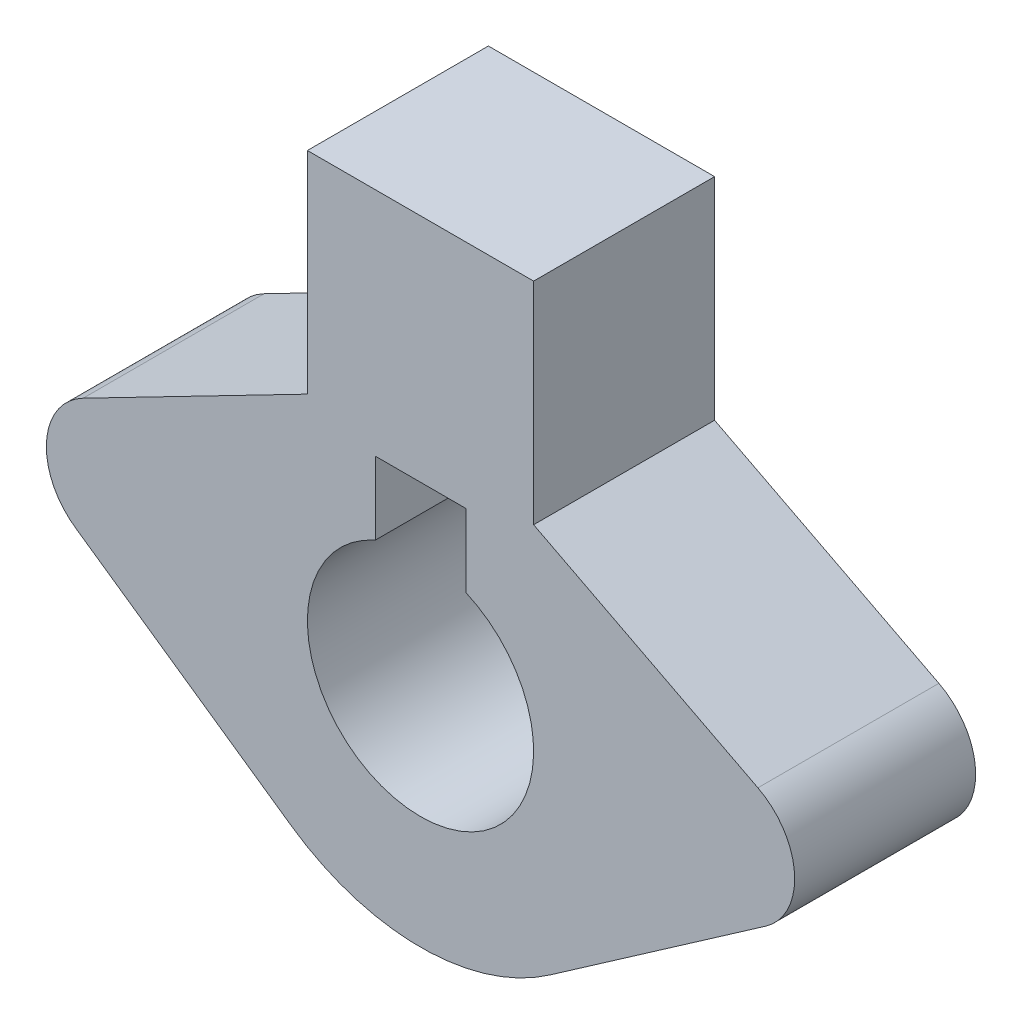
ISO-10303-21;
HEADER;
FILE_DESCRIPTION(('STEP AP214'),'2;1');
FILE_NAME('part.step','',(''),(''),'','','');
FILE_SCHEMA(('AUTOMOTIVE_DESIGN { 1 0 10303 214 1 1 1 1 }'));
ENDSEC;
DATA;
#1=APPLICATION_CONTEXT('core data for automotive mechanical design processes');
#2=APPLICATION_PROTOCOL_DEFINITION('international standard','automotive_design',2000,#1);
#3=PRODUCT_CONTEXT('',#1,'mechanical');
#4=PRODUCT('Part','Part','',(#3));
#5=PRODUCT_RELATED_PRODUCT_CATEGORY('part','',(#4));
#6=PRODUCT_DEFINITION_FORMATION('','',#4);
#7=PRODUCT_DEFINITION_CONTEXT('part definition',#1,'design');
#8=PRODUCT_DEFINITION('design','',#6,#7);
#9=PRODUCT_DEFINITION_SHAPE('','',#8);
#10=(LENGTH_UNIT() NAMED_UNIT(*) SI_UNIT(.MILLI.,.METRE.));
#11=(NAMED_UNIT(*) PLANE_ANGLE_UNIT() SI_UNIT($,.RADIAN.));
#12=(NAMED_UNIT(*) SI_UNIT($,.STERADIAN.) SOLID_ANGLE_UNIT());
#13=UNCERTAINTY_MEASURE_WITH_UNIT(LENGTH_MEASURE(1.E-05),#10,'distance_accuracy_value','');
#14=(GEOMETRIC_REPRESENTATION_CONTEXT(3) GLOBAL_UNCERTAINTY_ASSIGNED_CONTEXT((#13)) GLOBAL_UNIT_ASSIGNED_CONTEXT((#10,
#11,#12)) REPRESENTATION_CONTEXT('',''));
#15=CARTESIAN_POINT('',(0.,0.,0.));
#16=DIRECTION('',(0.,0.,1.));
#17=DIRECTION('',(1.,0.,0.));
#18=AXIS2_PLACEMENT_3D('',#15,#16,#17);
#19=CARTESIAN_POINT('',(0.,0.,8.));
#20=DIRECTION('',(0.,0.,-1.));
#21=DIRECTION('',(-1.,0.,0.));
#22=AXIS2_PLACEMENT_3D('',#19,#20,#21);
#23=CYLINDRICAL_SURFACE('',#22,10.);
#24=CARTESIAN_POINT('',(0.,0.,8.));
#25=DIRECTION('',(0.,0.,1.));
#26=DIRECTION('',(1.,0.,0.));
#27=AXIS2_PLACEMENT_3D('',#24,#25,#26);
#28=CIRCLE('',#27,10.);
#29=CARTESIAN_POINT('',(-5.71153754286938,-8.20843096434352,8.));
#30=VERTEX_POINT('',#29);
#31=CARTESIAN_POINT('',(5.71153754286938,-8.20843096434352,8.));
#32=VERTEX_POINT('',#31);
#33=EDGE_CURVE('E194',#30,#32,#28,.T.);
#34=ORIENTED_EDGE('',*,*,#33,.F.);
#35=DIRECTION('',(0.,0.,-1.));
#36=VECTOR('',#35,1.);
#37=CARTESIAN_POINT('',(-5.71153754286938,-8.20843096434352,30.5851332066531));
#38=LINE('',#37,#36);
#39=CARTESIAN_POINT('',(-5.71153754286938,-8.20843096434352,0.));
#40=VERTEX_POINT('',#39);
#41=EDGE_CURVE('E174',#30,#40,#38,.T.);
#42=ORIENTED_EDGE('',*,*,#41,.T.);
#43=CARTESIAN_POINT('',(0.,0.,0.));
#44=DIRECTION('',(0.,0.,1.));
#45=DIRECTION('',(1.,0.,0.));
#46=AXIS2_PLACEMENT_3D('',#43,#44,#45);
#47=CIRCLE('',#46,10.);
#48=CARTESIAN_POINT('',(5.71153754286938,-8.20843096434352,0.));
#49=VERTEX_POINT('',#48);
#50=EDGE_CURVE('E191',#40,#49,#47,.T.);
#51=ORIENTED_EDGE('',*,*,#50,.T.);
#52=DIRECTION('',(0.,0.,-1.));
#53=VECTOR('',#52,1.);
#54=CARTESIAN_POINT('',(5.71153754286938,-8.20843096434352,30.5851332066531));
#55=LINE('',#54,#53);
#56=EDGE_CURVE('E186',#32,#49,#55,.T.);
#57=ORIENTED_EDGE('',*,*,#56,.F.);
#58=EDGE_LOOP('',(#34,#42,#51,#57));
#59=FACE_BOUND('',#58,.T.);
#60=ADVANCED_FACE('F33',(#59),#23,.T.);
#61=CARTESIAN_POINT('',(0.,0.,8.));
#62=DIRECTION('',(0.,0.,1.));
#63=DIRECTION('',(1.,0.,0.));
#64=AXIS2_PLACEMENT_3D('',#61,#62,#63);
#65=PLANE('',#64);
#66=DIRECTION('',(0.,-1.,0.));
#67=VECTOR('',#66,1.);
#68=CARTESIAN_POINT('',(2.,3.5,8.00000000000001));
#69=LINE('',#68,#67);
#70=CARTESIAN_POINT('',(2.,7.8,8.00000000000001));
#71=VERTEX_POINT('',#70);
#72=CARTESIAN_POINT('',(2.,4.58257569495584,8.00000000000001));
#73=VERTEX_POINT('',#72);
#74=EDGE_CURVE('E154',#71,#73,#69,.T.);
#75=ORIENTED_EDGE('',*,*,#74,.T.);
#76=CARTESIAN_POINT('',(0.,0.,8.));
#77=DIRECTION('',(0.,0.,1.));
#78=DIRECTION('',(1.,0.,0.));
#79=AXIS2_PLACEMENT_3D('',#76,#77,#78);
#80=CIRCLE('',#79,5.);
#81=CARTESIAN_POINT('',(-2.,4.58257569495584,8.));
#82=VERTEX_POINT('',#81);
#83=EDGE_CURVE('E153',#82,#73,#80,.T.);
#84=ORIENTED_EDGE('',*,*,#83,.F.);
#85=DIRECTION('',(0.,1.,0.));
#86=VECTOR('',#85,1.);
#87=CARTESIAN_POINT('',(-2.,3.5,8.00000000000001));
#88=LINE('',#87,#86);
#89=CARTESIAN_POINT('',(-2.,7.8,8.00000000000001));
#90=VERTEX_POINT('',#89);
#91=EDGE_CURVE('E48',#82,#90,#88,.T.);
#92=ORIENTED_EDGE('',*,*,#91,.T.);
#93=DIRECTION('',(1.,0.,0.));
#94=VECTOR('',#93,1.);
#95=CARTESIAN_POINT('',(2.,7.8,8.00000000000001));
#96=LINE('',#95,#94);
#97=EDGE_CURVE('E142',#90,#71,#96,.T.);
#98=ORIENTED_EDGE('',*,*,#97,.T.);
#99=EDGE_LOOP('',(#75,#84,#92,#98));
#100=FACE_BOUND('',#99,.T.);
#101=DIRECTION('',(0.888760335053028,0.458372192477281,0.));
#102=VECTOR('',#101,1.);
#103=CARTESIAN_POINT('',(-19.342239894641,1.27599651710852,8.));
#104=LINE('',#103,#102);
#105=CARTESIAN_POINT('',(-14.9146845036805,3.55947856713505,8.));
#106=VERTEX_POINT('',#105);
#107=CARTESIAN_POINT('',(-5.,8.67291072024911,8.));
#108=VERTEX_POINT('',#107);
#109=EDGE_CURVE('E172',#106,#108,#104,.T.);
#110=ORIENTED_EDGE('',*,*,#109,.F.);
#111=CARTESIAN_POINT('',(-13.5395679262487,0.893197561975968,8.));
#112=DIRECTION('',(0.,0.,1.));
#113=DIRECTION('',(1.,0.,0.));
#114=AXIS2_PLACEMENT_3D('',#111,#112,#113);
#115=CIRCLE('',#114,3.);
#116=CARTESIAN_POINT('',(-15.2530291891095,-1.56933172732709,8.));
#117=VERTEX_POINT('',#116);
#118=EDGE_CURVE('E235',#106,#117,#115,.T.);
#119=ORIENTED_EDGE('',*,*,#118,.T.);
#120=DIRECTION('',(-0.820843096434353,0.571153754286938,0.));
#121=VECTOR('',#120,1.);
#122=CARTESIAN_POINT('',(-5.71153754286938,-8.20843096434352,8.));
#123=LINE('',#122,#121);
#124=EDGE_CURVE('E167',#30,#117,#123,.T.);
#125=ORIENTED_EDGE('',*,*,#124,.F.);
#126=ORIENTED_EDGE('',*,*,#33,.T.);
#127=DIRECTION('',(-0.820843096434353,-0.571153754286938,0.));
#128=VECTOR('',#127,1.);
#129=CARTESIAN_POINT('',(5.71153754286938,-8.20843096434352,8.));
#130=LINE('',#129,#128);
#131=CARTESIAN_POINT('',(15.2530291891095,-1.56933172732709,8.));
#132=VERTEX_POINT('',#131);
#133=EDGE_CURVE('E184',#132,#32,#130,.T.);
#134=ORIENTED_EDGE('',*,*,#133,.F.);
#135=CARTESIAN_POINT('',(13.5395679262487,0.893197561975969,8.));
#136=DIRECTION('',(0.,0.,1.));
#137=DIRECTION('',(1.,0.,0.));
#138=AXIS2_PLACEMENT_3D('',#135,#136,#137);
#139=CIRCLE('',#138,3.);
#140=CARTESIAN_POINT('',(14.9146845036805,3.55947856713505,8.));
#141=VERTEX_POINT('',#140);
#142=EDGE_CURVE('E56',#132,#141,#139,.T.);
#143=ORIENTED_EDGE('',*,*,#142,.T.);
#144=DIRECTION('',(0.888760335053028,-0.458372192477281,0.));
#145=VECTOR('',#144,1.);
#146=CARTESIAN_POINT('',(19.342239894641,1.27599651710852,8.));
#147=LINE('',#146,#145);
#148=CARTESIAN_POINT('',(5.,8.67291072024911,8.));
#149=VERTEX_POINT('',#148);
#150=EDGE_CURVE('E180',#149,#141,#147,.T.);
#151=ORIENTED_EDGE('',*,*,#150,.F.);
#152=DIRECTION('',(0.,1.,0.));
#153=VECTOR('',#152,1.);
#154=CARTESIAN_POINT('',(5.,8.66025403784439,8.));
#155=LINE('',#154,#153);
#156=CARTESIAN_POINT('',(5.,18.,8.));
#157=VERTEX_POINT('',#156);
#158=EDGE_CURVE('E197',#149,#157,#155,.T.);
#159=ORIENTED_EDGE('',*,*,#158,.T.);
#160=DIRECTION('',(-1.,0.,0.));
#161=VECTOR('',#160,1.);
#162=CARTESIAN_POINT('',(-5.,18.,8.));
#163=LINE('',#162,#161);
#164=CARTESIAN_POINT('',(-5.,18.,8.));
#165=VERTEX_POINT('',#164);
#166=EDGE_CURVE('E200',#157,#165,#163,.T.);
#167=ORIENTED_EDGE('',*,*,#166,.T.);
#168=DIRECTION('',(0.,-1.,0.));
#169=VECTOR('',#168,1.);
#170=CARTESIAN_POINT('',(-5.,8.66025403784439,8.));
#171=LINE('',#170,#169);
#172=EDGE_CURVE('E202',#165,#108,#171,.T.);
#173=ORIENTED_EDGE('',*,*,#172,.T.);
#174=EDGE_LOOP('',(#110,#119,#125,#126,#134,#143,#151,#159,#167,#173));
#175=FACE_BOUND('',#174,.T.);
#176=ADVANCED_FACE('F151',(#100,#175),#65,.T.);
#177=CARTESIAN_POINT('',(0.,0.,0.));
#178=DIRECTION('',(0.,0.,1.));
#179=DIRECTION('',(1.,0.,0.));
#180=AXIS2_PLACEMENT_3D('',#177,#178,#179);
#181=PLANE('',#180);
#182=DIRECTION('',(-0.820843096434353,0.571153754286938,0.));
#183=VECTOR('',#182,1.);
#184=CARTESIAN_POINT('',(-5.71153754286938,-8.20843096434352,0.));
#185=LINE('',#184,#183);
#186=CARTESIAN_POINT('',(-15.2530291891095,-1.56933172732709,0.));
#187=VERTEX_POINT('',#186);
#188=EDGE_CURVE('E163',#40,#187,#185,.T.);
#189=ORIENTED_EDGE('',*,*,#188,.T.);
#190=CARTESIAN_POINT('',(-13.5395679262487,0.893197561975968,0.));
#191=DIRECTION('',(0.,0.,1.));
#192=DIRECTION('',(1.,0.,0.));
#193=AXIS2_PLACEMENT_3D('',#190,#191,#192);
#194=CIRCLE('',#193,3.);
#195=CARTESIAN_POINT('',(-14.9146845036805,3.55947856713505,0.));
#196=VERTEX_POINT('',#195);
#197=EDGE_CURVE('E230',#187,#196,#194,.F.);
#198=ORIENTED_EDGE('',*,*,#197,.T.);
#199=DIRECTION('',(0.888760335053028,0.458372192477281,0.));
#200=VECTOR('',#199,1.);
#201=CARTESIAN_POINT('',(-19.342239894641,1.27599651710852,0.));
#202=LINE('',#201,#200);
#203=CARTESIAN_POINT('',(-5.,8.67291072024911,0.));
#204=VERTEX_POINT('',#203);
#205=EDGE_CURVE('E165',#196,#204,#202,.T.);
#206=ORIENTED_EDGE('',*,*,#205,.T.);
#207=DIRECTION('',(0.,-1.,0.));
#208=VECTOR('',#207,1.);
#209=CARTESIAN_POINT('',(-5.,8.66025403784439,0.));
#210=LINE('',#209,#208);
#211=CARTESIAN_POINT('',(-5.,18.,0.));
#212=VERTEX_POINT('',#211);
#213=EDGE_CURVE('E198',#212,#204,#210,.T.);
#214=ORIENTED_EDGE('',*,*,#213,.F.);
#215=DIRECTION('',(-1.,0.,0.));
#216=VECTOR('',#215,1.);
#217=CARTESIAN_POINT('',(-5.,18.,0.));
#218=LINE('',#217,#216);
#219=CARTESIAN_POINT('',(5.,18.,0.));
#220=VERTEX_POINT('',#219);
#221=EDGE_CURVE('E210',#220,#212,#218,.T.);
#222=ORIENTED_EDGE('',*,*,#221,.F.);
#223=DIRECTION('',(0.,1.,0.));
#224=VECTOR('',#223,1.);
#225=CARTESIAN_POINT('',(5.,8.66025403784439,0.));
#226=LINE('',#225,#224);
#227=CARTESIAN_POINT('',(5.,8.67291072024911,0.));
#228=VERTEX_POINT('',#227);
#229=EDGE_CURVE('E208',#228,#220,#226,.T.);
#230=ORIENTED_EDGE('',*,*,#229,.F.);
#231=DIRECTION('',(0.888760335053028,-0.458372192477281,0.));
#232=VECTOR('',#231,1.);
#233=CARTESIAN_POINT('',(19.342239894641,1.27599651710852,0.));
#234=LINE('',#233,#232);
#235=CARTESIAN_POINT('',(14.9146845036805,3.55947856713505,0.));
#236=VERTEX_POINT('',#235);
#237=EDGE_CURVE('E177',#228,#236,#234,.T.);
#238=ORIENTED_EDGE('',*,*,#237,.T.);
#239=CARTESIAN_POINT('',(13.5395679262487,0.893197561975969,0.));
#240=DIRECTION('',(0.,0.,1.));
#241=DIRECTION('',(1.,0.,0.));
#242=AXIS2_PLACEMENT_3D('',#239,#240,#241);
#243=CIRCLE('',#242,3.);
#244=CARTESIAN_POINT('',(15.2530291891095,-1.56933172732709,0.));
#245=VERTEX_POINT('',#244);
#246=EDGE_CURVE('E228',#236,#245,#243,.F.);
#247=ORIENTED_EDGE('',*,*,#246,.T.);
#248=DIRECTION('',(-0.820843096434353,-0.571153754286938,0.));
#249=VECTOR('',#248,1.);
#250=CARTESIAN_POINT('',(5.71153754286938,-8.20843096434352,0.));
#251=LINE('',#250,#249);
#252=EDGE_CURVE('E178',#245,#49,#251,.T.);
#253=ORIENTED_EDGE('',*,*,#252,.T.);
#254=ORIENTED_EDGE('',*,*,#50,.F.);
#255=EDGE_LOOP('',(#189,#198,#206,#214,#222,#230,#238,#247,#253,#254));
#256=FACE_BOUND('',#255,.T.);
#257=CARTESIAN_POINT('',(0.,0.,0.));
#258=DIRECTION('',(0.,0.,1.));
#259=DIRECTION('',(1.,0.,0.));
#260=AXIS2_PLACEMENT_3D('',#257,#258,#259);
#261=CIRCLE('',#260,5.);
#262=CARTESIAN_POINT('',(-2.,4.58257569495584,0.));
#263=VERTEX_POINT('',#262);
#264=CARTESIAN_POINT('',(2.,4.58257569495584,0.));
#265=VERTEX_POINT('',#264);
#266=EDGE_CURVE('E189',#263,#265,#261,.T.);
#267=ORIENTED_EDGE('',*,*,#266,.T.);
#268=DIRECTION('',(0.,-1.,0.));
#269=VECTOR('',#268,1.);
#270=CARTESIAN_POINT('',(2.,3.5,0.));
#271=LINE('',#270,#269);
#272=CARTESIAN_POINT('',(2.,7.8,0.));
#273=VERTEX_POINT('',#272);
#274=EDGE_CURVE('E159',#273,#265,#271,.T.);
#275=ORIENTED_EDGE('',*,*,#274,.F.);
#276=DIRECTION('',(1.,0.,0.));
#277=VECTOR('',#276,1.);
#278=CARTESIAN_POINT('',(2.,7.8,0.));
#279=LINE('',#278,#277);
#280=CARTESIAN_POINT('',(-2.,7.8,0.));
#281=VERTEX_POINT('',#280);
#282=EDGE_CURVE('E156',#281,#273,#279,.T.);
#283=ORIENTED_EDGE('',*,*,#282,.F.);
#284=DIRECTION('',(0.,1.,0.));
#285=VECTOR('',#284,1.);
#286=CARTESIAN_POINT('',(-2.,3.5,0.));
#287=LINE('',#286,#285);
#288=EDGE_CURVE('E137',#263,#281,#287,.T.);
#289=ORIENTED_EDGE('',*,*,#288,.F.);
#290=EDGE_LOOP('',(#267,#275,#283,#289));
#291=FACE_BOUND('',#290,.T.);
#292=ADVANCED_FACE('F244',(#256,#291),#181,.F.);
#293=CARTESIAN_POINT('',(5.,8.66025403784439,8.));
#294=DIRECTION('',(-1.,0.,0.));
#295=DIRECTION('',(0.,-1.,0.));
#296=AXIS2_PLACEMENT_3D('',#293,#294,#295);
#297=PLANE('',#296);
#298=ORIENTED_EDGE('',*,*,#158,.F.);
#299=DIRECTION('',(0.,0.,-1.));
#300=VECTOR('',#299,1.);
#301=CARTESIAN_POINT('',(5.,8.67291072024911,8.));
#302=LINE('',#301,#300);
#303=EDGE_CURVE('E219',#149,#228,#302,.T.);
#304=ORIENTED_EDGE('',*,*,#303,.T.);
#305=ORIENTED_EDGE('',*,*,#229,.T.);
#306=DIRECTION('',(0.,0.,-1.));
#307=VECTOR('',#306,1.);
#308=CARTESIAN_POINT('',(5.,18.,8.));
#309=LINE('',#308,#307);
#310=EDGE_CURVE('E216',#157,#220,#309,.T.);
#311=ORIENTED_EDGE('',*,*,#310,.F.);
#312=EDGE_LOOP('',(#298,#304,#305,#311));
#313=FACE_BOUND('',#312,.T.);
#314=ADVANCED_FACE('F270',(#313),#297,.F.);
#315=CARTESIAN_POINT('',(-5.,18.,8.));
#316=DIRECTION('',(0.,-1.,0.));
#317=DIRECTION('',(0.,0.,-1.));
#318=AXIS2_PLACEMENT_3D('',#315,#316,#317);
#319=PLANE('',#318);
#320=ORIENTED_EDGE('',*,*,#221,.T.);
#321=DIRECTION('',(0.,0.,-1.));
#322=VECTOR('',#321,1.);
#323=CARTESIAN_POINT('',(-5.,18.,8.));
#324=LINE('',#323,#322);
#325=EDGE_CURVE('E205',#165,#212,#324,.T.);
#326=ORIENTED_EDGE('',*,*,#325,.F.);
#327=ORIENTED_EDGE('',*,*,#166,.F.);
#328=ORIENTED_EDGE('',*,*,#310,.T.);
#329=EDGE_LOOP('',(#320,#326,#327,#328));
#330=FACE_BOUND('',#329,.T.);
#331=ADVANCED_FACE('F303',(#330),#319,.F.);
#332=CARTESIAN_POINT('',(-5.,8.66025403784439,8.));
#333=DIRECTION('',(1.,0.,0.));
#334=DIRECTION('',(0.,1.,0.));
#335=AXIS2_PLACEMENT_3D('',#332,#333,#334);
#336=PLANE('',#335);
#337=ORIENTED_EDGE('',*,*,#213,.T.);
#338=DIRECTION('',(0.,0.,1.));
#339=VECTOR('',#338,1.);
#340=CARTESIAN_POINT('',(-5.,8.67291072024911,8.));
#341=LINE('',#340,#339);
#342=EDGE_CURVE('E222',#204,#108,#341,.T.);
#343=ORIENTED_EDGE('',*,*,#342,.T.);
#344=ORIENTED_EDGE('',*,*,#172,.F.);
#345=ORIENTED_EDGE('',*,*,#325,.T.);
#346=EDGE_LOOP('',(#337,#343,#344,#345));
#347=FACE_BOUND('',#346,.T.);
#348=ADVANCED_FACE('F307',(#347),#336,.F.);
#349=CARTESIAN_POINT('',(0.,0.,8.));
#350=DIRECTION('',(0.,0.,-1.));
#351=DIRECTION('',(-1.,0.,0.));
#352=AXIS2_PLACEMENT_3D('',#349,#350,#351);
#353=CYLINDRICAL_SURFACE('',#352,5.);
#354=DIRECTION('',(0.,0.,-1.));
#355=VECTOR('',#354,1.);
#356=CARTESIAN_POINT('',(2.,4.58257569495584,8.));
#357=LINE('',#356,#355);
#358=EDGE_CURVE('E11',#265,#73,#357,.F.);
#359=ORIENTED_EDGE('',*,*,#358,.F.);
#360=ORIENTED_EDGE('',*,*,#266,.F.);
#361=DIRECTION('',(0.,0.,-1.));
#362=VECTOR('',#361,1.);
#363=CARTESIAN_POINT('',(-2.,4.58257569495584,8.));
#364=LINE('',#363,#362);
#365=EDGE_CURVE('E41',#82,#263,#364,.T.);
#366=ORIENTED_EDGE('',*,*,#365,.F.);
#367=ORIENTED_EDGE('',*,*,#83,.T.);
#368=EDGE_LOOP('',(#359,#360,#366,#367));
#369=FACE_BOUND('',#368,.T.);
#370=ADVANCED_FACE('F247',(#369),#353,.F.);
#371=CARTESIAN_POINT('',(19.342239894641,1.27599651710852,30.5851332066531));
#372=DIRECTION('',(0.458372192477281,0.888760335053028,0.));
#373=DIRECTION('',(-0.888760335053028,0.458372192477281,0.));
#374=AXIS2_PLACEMENT_3D('',#371,#372,#373);
#375=PLANE('',#374);
#376=ORIENTED_EDGE('',*,*,#150,.T.);
#377=DIRECTION('',(0.,0.,-1.));
#378=VECTOR('',#377,1.);
#379=CARTESIAN_POINT('',(14.9146845036805,3.55947856713505,30.5851332066531));
#380=LINE('',#379,#378);
#381=EDGE_CURVE('E237',#141,#236,#380,.T.);
#382=ORIENTED_EDGE('',*,*,#381,.T.);
#383=ORIENTED_EDGE('',*,*,#237,.F.);
#384=ORIENTED_EDGE('',*,*,#303,.F.);
#385=EDGE_LOOP('',(#376,#382,#383,#384));
#386=FACE_BOUND('',#385,.T.);
#387=ADVANCED_FACE('F292',(#386),#375,.T.);
#388=CARTESIAN_POINT('',(5.71153754286938,-8.20843096434352,30.5851332066531));
#389=DIRECTION('',(0.571153754286938,-0.820843096434353,0.));
#390=DIRECTION('',(0.820843096434353,0.571153754286938,0.));
#391=AXIS2_PLACEMENT_3D('',#388,#389,#390);
#392=PLANE('',#391);
#393=ORIENTED_EDGE('',*,*,#252,.F.);
#394=DIRECTION('',(0.,0.,-1.));
#395=VECTOR('',#394,1.);
#396=CARTESIAN_POINT('',(15.2530291891095,-1.56933172732709,30.5851332066531));
#397=LINE('',#396,#395);
#398=EDGE_CURVE('E240',#245,#132,#397,.F.);
#399=ORIENTED_EDGE('',*,*,#398,.T.);
#400=ORIENTED_EDGE('',*,*,#133,.T.);
#401=ORIENTED_EDGE('',*,*,#56,.T.);
#402=EDGE_LOOP('',(#393,#399,#400,#401));
#403=FACE_BOUND('',#402,.T.);
#404=ADVANCED_FACE('F311',(#403),#392,.T.);
#405=CARTESIAN_POINT('',(-19.342239894641,1.27599651710852,30.5851332066531));
#406=DIRECTION('',(-0.458372192477281,0.888760335053028,0.));
#407=DIRECTION('',(-0.888760335053028,-0.458372192477281,0.));
#408=AXIS2_PLACEMENT_3D('',#405,#406,#407);
#409=PLANE('',#408);
#410=ORIENTED_EDGE('',*,*,#205,.F.);
#411=DIRECTION('',(0.,0.,-1.));
#412=VECTOR('',#411,1.);
#413=CARTESIAN_POINT('',(-14.9146845036805,3.55947856713505,30.5851332066531));
#414=LINE('',#413,#412);
#415=EDGE_CURVE('E232',#196,#106,#414,.F.);
#416=ORIENTED_EDGE('',*,*,#415,.T.);
#417=ORIENTED_EDGE('',*,*,#109,.T.);
#418=ORIENTED_EDGE('',*,*,#342,.F.);
#419=EDGE_LOOP('',(#410,#416,#417,#418));
#420=FACE_BOUND('',#419,.T.);
#421=ADVANCED_FACE('F278',(#420),#409,.T.);
#422=CARTESIAN_POINT('',(-5.71153754286938,-8.20843096434352,30.5851332066531));
#423=DIRECTION('',(-0.571153754286938,-0.820843096434353,0.));
#424=DIRECTION('',(0.820843096434353,-0.571153754286938,0.));
#425=AXIS2_PLACEMENT_3D('',#422,#423,#424);
#426=PLANE('',#425);
#427=ORIENTED_EDGE('',*,*,#124,.T.);
#428=DIRECTION('',(0.,0.,-1.));
#429=VECTOR('',#428,1.);
#430=CARTESIAN_POINT('',(-15.2530291891095,-1.56933172732709,30.5851332066531));
#431=LINE('',#430,#429);
#432=EDGE_CURVE('E225',#117,#187,#431,.T.);
#433=ORIENTED_EDGE('',*,*,#432,.T.);
#434=ORIENTED_EDGE('',*,*,#188,.F.);
#435=ORIENTED_EDGE('',*,*,#41,.F.);
#436=EDGE_LOOP('',(#427,#433,#434,#435));
#437=FACE_BOUND('',#436,.T.);
#438=ADVANCED_FACE('F273',(#437),#426,.T.);
#439=CARTESIAN_POINT('',(-13.5395679262487,0.893197561975968,30.5851332066531));
#440=DIRECTION('',(0.,0.,-1.));
#441=DIRECTION('',(-1.,0.,0.));
#442=AXIS2_PLACEMENT_3D('',#439,#440,#441);
#443=CYLINDRICAL_SURFACE('',#442,3.);
#444=ORIENTED_EDGE('',*,*,#118,.F.);
#445=ORIENTED_EDGE('',*,*,#415,.F.);
#446=ORIENTED_EDGE('',*,*,#197,.F.);
#447=ORIENTED_EDGE('',*,*,#432,.F.);
#448=EDGE_LOOP('',(#444,#445,#446,#447));
#449=FACE_BOUND('',#448,.T.);
#450=ADVANCED_FACE('F257',(#449),#443,.T.);
#451=CARTESIAN_POINT('',(13.5395679262487,0.893197561975969,30.5851332066531));
#452=DIRECTION('',(0.,0.,-1.));
#453=DIRECTION('',(-1.,0.,0.));
#454=AXIS2_PLACEMENT_3D('',#451,#452,#453);
#455=CYLINDRICAL_SURFACE('',#454,3.);
#456=ORIENTED_EDGE('',*,*,#142,.F.);
#457=ORIENTED_EDGE('',*,*,#398,.F.);
#458=ORIENTED_EDGE('',*,*,#246,.F.);
#459=ORIENTED_EDGE('',*,*,#381,.F.);
#460=EDGE_LOOP('',(#456,#457,#458,#459));
#461=FACE_BOUND('',#460,.T.);
#462=ADVANCED_FACE('F35',(#461),#455,.T.);
#463=CARTESIAN_POINT('',(2.,3.5,8.00000000000001));
#464=DIRECTION('',(1.,0.,0.));
#465=DIRECTION('',(0.,0.,-1.));
#466=AXIS2_PLACEMENT_3D('',#463,#464,#465);
#467=PLANE('',#466);
#468=ORIENTED_EDGE('',*,*,#358,.T.);
#469=ORIENTED_EDGE('',*,*,#74,.F.);
#470=DIRECTION('',(0.,0.,-1.));
#471=VECTOR('',#470,1.);
#472=CARTESIAN_POINT('',(2.,7.8,8.00000000000001));
#473=LINE('',#472,#471);
#474=EDGE_CURVE('E141',#71,#273,#473,.T.);
#475=ORIENTED_EDGE('',*,*,#474,.T.);
#476=ORIENTED_EDGE('',*,*,#274,.T.);
#477=EDGE_LOOP('',(#468,#469,#475,#476));
#478=FACE_BOUND('',#477,.T.);
#479=ADVANCED_FACE('F249',(#478),#467,.F.);
#480=CARTESIAN_POINT('',(2.,7.8,8.00000000000001));
#481=DIRECTION('',(0.,1.,0.));
#482=DIRECTION('',(0.,0.,1.));
#483=AXIS2_PLACEMENT_3D('',#480,#481,#482);
#484=PLANE('',#483);
#485=ORIENTED_EDGE('',*,*,#282,.T.);
#486=ORIENTED_EDGE('',*,*,#474,.F.);
#487=ORIENTED_EDGE('',*,*,#97,.F.);
#488=DIRECTION('',(0.,0.,-1.));
#489=VECTOR('',#488,1.);
#490=CARTESIAN_POINT('',(-2.,7.8,8.00000000000001));
#491=LINE('',#490,#489);
#492=EDGE_CURVE('E133',#90,#281,#491,.T.);
#493=ORIENTED_EDGE('',*,*,#492,.T.);
#494=EDGE_LOOP('',(#485,#486,#487,#493));
#495=FACE_BOUND('',#494,.T.);
#496=ADVANCED_FACE('F145',(#495),#484,.F.);
#497=CARTESIAN_POINT('',(-2.,3.5,8.00000000000001));
#498=DIRECTION('',(-1.,0.,0.));
#499=DIRECTION('',(0.,0.,1.));
#500=AXIS2_PLACEMENT_3D('',#497,#498,#499);
#501=PLANE('',#500);
#502=ORIENTED_EDGE('',*,*,#365,.T.);
#503=ORIENTED_EDGE('',*,*,#288,.T.);
#504=ORIENTED_EDGE('',*,*,#492,.F.);
#505=ORIENTED_EDGE('',*,*,#91,.F.);
#506=EDGE_LOOP('',(#502,#503,#504,#505));
#507=FACE_BOUND('',#506,.T.);
#508=ADVANCED_FACE('F135',(#507),#501,.F.);
#509=CLOSED_SHELL('',(#60,#176,#292,#314,#331,#348,#370,#387,#404,#421,#438,#450,#462,#479,#496,#508));
#510=MANIFOLD_SOLID_BREP('B2',#509);
#511=ADVANCED_BREP_SHAPE_REPRESENTATION('',(#18,#510),#14);
#512=SHAPE_DEFINITION_REPRESENTATION(#9,#511);
ENDSEC;
END-ISO-10303-21;
